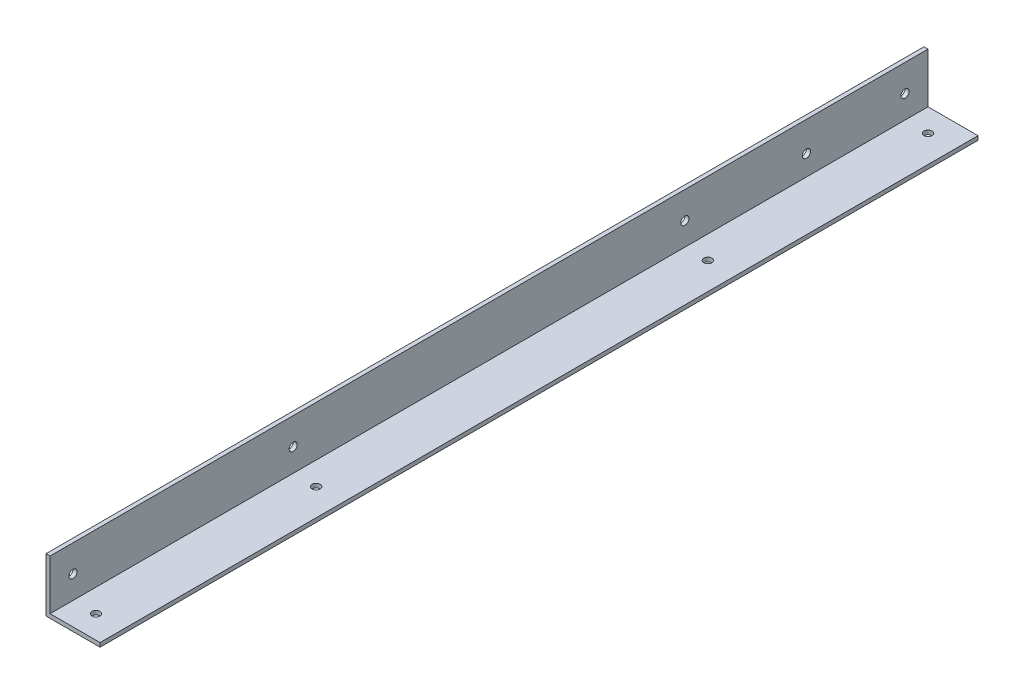
ISO-10303-21;
HEADER;
FILE_DESCRIPTION(('STEP AP214'),'2;1');
FILE_NAME('part.step','',(''),(''),'','','');
FILE_SCHEMA(('AUTOMOTIVE_DESIGN { 1 0 10303 214 1 1 1 1 }'));
ENDSEC;
DATA;
#1=APPLICATION_CONTEXT('core data for automotive mechanical design processes');
#2=APPLICATION_PROTOCOL_DEFINITION('international standard','automotive_design',2000,#1);
#3=PRODUCT_CONTEXT('',#1,'mechanical');
#4=PRODUCT('Part','Part','',(#3));
#5=PRODUCT_RELATED_PRODUCT_CATEGORY('part','',(#4));
#6=PRODUCT_DEFINITION_FORMATION('','',#4);
#7=PRODUCT_DEFINITION_CONTEXT('part definition',#1,'design');
#8=PRODUCT_DEFINITION('design','',#6,#7);
#9=PRODUCT_DEFINITION_SHAPE('','',#8);
#10=(LENGTH_UNIT() NAMED_UNIT(*) SI_UNIT(.MILLI.,.METRE.));
#11=(NAMED_UNIT(*) PLANE_ANGLE_UNIT() SI_UNIT($,.RADIAN.));
#12=(NAMED_UNIT(*) SI_UNIT($,.STERADIAN.) SOLID_ANGLE_UNIT());
#13=UNCERTAINTY_MEASURE_WITH_UNIT(LENGTH_MEASURE(1.E-05),#10,'distance_accuracy_value','');
#14=(GEOMETRIC_REPRESENTATION_CONTEXT(3) GLOBAL_UNCERTAINTY_ASSIGNED_CONTEXT((#13)) GLOBAL_UNIT_ASSIGNED_CONTEXT((#10,
#11,#12)) REPRESENTATION_CONTEXT('',''));
#15=CARTESIAN_POINT('',(0.,0.,0.));
#16=DIRECTION('',(0.,0.,1.));
#17=DIRECTION('',(1.,0.,0.));
#18=AXIS2_PLACEMENT_3D('',#15,#16,#17);
#19=CARTESIAN_POINT('',(-15.9316863798358,4.77336842105263,325.));
#20=DIRECTION('',(0.,-1.,0.));
#21=DIRECTION('',(1.,0.,0.));
#22=AXIS2_PLACEMENT_3D('',#19,#20,#21);
#23=PLANE('',#22);
#24=DIRECTION('',(-1.,0.,0.));
#25=VECTOR('',#24,1.);
#26=CARTESIAN_POINT('',(-15.9316863798358,4.77336842105263,0.));
#27=LINE('',#26,#25);
#28=CARTESIAN_POINT('',(-15.9316863798358,4.77336842105263,0.));
#29=VERTEX_POINT('',#28);
#30=CARTESIAN_POINT('',(-17.4316863798358,4.77336842105263,0.));
#31=VERTEX_POINT('',#30);
#32=EDGE_CURVE('E115',#29,#31,#27,.T.);
#33=ORIENTED_EDGE('',*,*,#32,.T.);
#34=DIRECTION('',(0.,0.,-1.));
#35=VECTOR('',#34,1.);
#36=CARTESIAN_POINT('',(-17.4316863798358,4.77336842105263,325.));
#37=LINE('',#36,#35);
#38=CARTESIAN_POINT('',(-17.4316863798358,4.77336842105263,325.));
#39=VERTEX_POINT('',#38);
#40=EDGE_CURVE('E11',#39,#31,#37,.T.);
#41=ORIENTED_EDGE('',*,*,#40,.F.);
#42=DIRECTION('',(-1.,0.,0.));
#43=VECTOR('',#42,1.);
#44=CARTESIAN_POINT('',(-15.9316863798358,4.77336842105263,325.));
#45=LINE('',#44,#43);
#46=CARTESIAN_POINT('',(-15.9316863798358,4.77336842105263,325.));
#47=VERTEX_POINT('',#46);
#48=EDGE_CURVE('E126',#47,#39,#45,.T.);
#49=ORIENTED_EDGE('',*,*,#48,.F.);
#50=DIRECTION('',(0.,0.,-1.));
#51=VECTOR('',#50,1.);
#52=CARTESIAN_POINT('',(-15.9316863798358,4.77336842105263,325.));
#53=LINE('',#52,#51);
#54=EDGE_CURVE('E111',#47,#29,#53,.T.);
#55=ORIENTED_EDGE('',*,*,#54,.T.);
#56=EDGE_LOOP('',(#33,#41,#49,#55));
#57=FACE_BOUND('',#56,.T.);
#58=ADVANCED_FACE('F31',(#57),#23,.F.);
#59=CARTESIAN_POINT('',(-17.4316863798358,4.77336842105263,325.));
#60=DIRECTION('',(1.,0.,0.));
#61=DIRECTION('',(0.,1.,0.));
#62=AXIS2_PLACEMENT_3D('',#59,#60,#61);
#63=PLANE('',#62);
#64=CARTESIAN_POINT('',(-17.4316863798358,-6.22663157894737,45.));
#65=DIRECTION('',(1.,0.,0.));
#66=DIRECTION('',(0.,1.,0.));
#67=AXIS2_PLACEMENT_3D('',#64,#65,#66);
#68=CIRCLE('',#67,1.5);
#69=CARTESIAN_POINT('',(-17.4316863798358,-4.72663157894736,45.));
#70=VERTEX_POINT('',#69);
#71=EDGE_CURVE('E298',#70,#70,#68,.T.);
#72=ORIENTED_EDGE('',*,*,#71,.T.);
#73=EDGE_LOOP('',(#72));
#74=FACE_BOUND('',#73,.T.);
#75=CARTESIAN_POINT('',(-17.4316863798358,-5.22663157894737,90.));
#76=DIRECTION('',(1.,0.,0.));
#77=DIRECTION('',(0.,1.,0.));
#78=AXIS2_PLACEMENT_3D('',#75,#76,#77);
#79=CIRCLE('',#78,1.5);
#80=CARTESIAN_POINT('',(-17.4316863798358,-3.72663157894737,90.));
#81=VERTEX_POINT('',#80);
#82=EDGE_CURVE('E302',#81,#81,#79,.T.);
#83=ORIENTED_EDGE('',*,*,#82,.T.);
#84=EDGE_LOOP('',(#83));
#85=FACE_BOUND('',#84,.T.);
#86=CARTESIAN_POINT('',(-17.4316863798358,-5.22663157894737,235.));
#87=DIRECTION('',(1.,0.,0.));
#88=DIRECTION('',(0.,1.,0.));
#89=AXIS2_PLACEMENT_3D('',#86,#87,#88);
#90=CIRCLE('',#89,1.50000000000003);
#91=CARTESIAN_POINT('',(-17.4316863798358,-3.72663157894734,235.));
#92=VERTEX_POINT('',#91);
#93=EDGE_CURVE('E311',#92,#92,#90,.T.);
#94=ORIENTED_EDGE('',*,*,#93,.T.);
#95=EDGE_LOOP('',(#94));
#96=FACE_BOUND('',#95,.T.);
#97=CARTESIAN_POINT('',(-17.4316863798358,-5.22663157894737,8.50000000000001));
#98=DIRECTION('',(1.,0.,0.));
#99=DIRECTION('',(0.,1.,0.));
#100=AXIS2_PLACEMENT_3D('',#97,#98,#99);
#101=CIRCLE('',#100,1.5);
#102=CARTESIAN_POINT('',(-17.4316863798358,-3.72663157894737,8.50000000000001));
#103=VERTEX_POINT('',#102);
#104=EDGE_CURVE('E317',#103,#103,#101,.T.);
#105=ORIENTED_EDGE('',*,*,#104,.T.);
#106=EDGE_LOOP('',(#105));
#107=FACE_BOUND('',#106,.T.);
#108=CARTESIAN_POINT('',(-17.4316863798358,-5.22663157894737,316.5));
#109=DIRECTION('',(1.,0.,0.));
#110=DIRECTION('',(0.,1.,0.));
#111=AXIS2_PLACEMENT_3D('',#108,#109,#110);
#112=CIRCLE('',#111,1.50000000000002);
#113=CARTESIAN_POINT('',(-17.4316863798358,-3.72663157894735,316.5));
#114=VERTEX_POINT('',#113);
#115=EDGE_CURVE('E323',#114,#114,#112,.T.);
#116=ORIENTED_EDGE('',*,*,#115,.T.);
#117=EDGE_LOOP('',(#116));
#118=FACE_BOUND('',#117,.T.);
#119=DIRECTION('',(0.,-1.,0.));
#120=VECTOR('',#119,1.);
#121=CARTESIAN_POINT('',(-17.4316863798358,4.77336842105263,0.));
#122=LINE('',#121,#120);
#123=CARTESIAN_POINT('',(-17.4316863798357,-15.2266315789474,0.));
#124=VERTEX_POINT('',#123);
#125=EDGE_CURVE('E118',#31,#124,#122,.T.);
#126=ORIENTED_EDGE('',*,*,#125,.T.);
#127=DIRECTION('',(0.,0.,-1.));
#128=VECTOR('',#127,1.);
#129=CARTESIAN_POINT('',(-17.4316863798357,-15.2266315789474,325.));
#130=LINE('',#129,#128);
#131=CARTESIAN_POINT('',(-17.4316863798357,-15.2266315789474,325.));
#132=VERTEX_POINT('',#131);
#133=EDGE_CURVE('E39',#132,#124,#130,.T.);
#134=ORIENTED_EDGE('',*,*,#133,.F.);
#135=DIRECTION('',(0.,-1.,0.));
#136=VECTOR('',#135,1.);
#137=CARTESIAN_POINT('',(-17.4316863798358,4.77336842105263,325.));
#138=LINE('',#137,#136);
#139=EDGE_CURVE('E84',#39,#132,#138,.T.);
#140=ORIENTED_EDGE('',*,*,#139,.F.);
#141=ORIENTED_EDGE('',*,*,#40,.T.);
#142=EDGE_LOOP('',(#126,#134,#140,#141));
#143=FACE_BOUND('',#142,.T.);
#144=ADVANCED_FACE('F154',(#74,#85,#96,#107,#118,#143),#63,.F.);
#145=CARTESIAN_POINT('',(-17.4316863798357,-15.2266315789474,325.));
#146=DIRECTION('',(0.,1.,0.));
#147=DIRECTION('',(0.,0.,1.));
#148=AXIS2_PLACEMENT_3D('',#145,#146,#147);
#149=PLANE('',#148);
#150=CARTESIAN_POINT('',(-7.43168637983575,-15.2266315789474,90.));
#151=DIRECTION('',(0.,1.,0.));
#152=DIRECTION('',(0.,0.,1.));
#153=AXIS2_PLACEMENT_3D('',#150,#151,#152);
#154=CIRCLE('',#153,1.5);
#155=CARTESIAN_POINT('',(-7.43168637983575,-15.2266315789474,91.5));
#156=VERTEX_POINT('',#155);
#157=EDGE_CURVE('E329',#156,#156,#154,.T.);
#158=ORIENTED_EDGE('',*,*,#157,.T.);
#159=EDGE_LOOP('',(#158));
#160=FACE_BOUND('',#159,.T.);
#161=CARTESIAN_POINT('',(-7.43168637983575,-15.2266315789474,235.));
#162=DIRECTION('',(0.,1.,0.));
#163=DIRECTION('',(0.,0.,1.));
#164=AXIS2_PLACEMENT_3D('',#161,#162,#163);
#165=CIRCLE('',#164,1.5);
#166=CARTESIAN_POINT('',(-7.43168637983575,-15.2266315789474,236.5));
#167=VERTEX_POINT('',#166);
#168=EDGE_CURVE('E335',#167,#167,#165,.T.);
#169=ORIENTED_EDGE('',*,*,#168,.T.);
#170=EDGE_LOOP('',(#169));
#171=FACE_BOUND('',#170,.T.);
#172=CARTESIAN_POINT('',(-7.43168637983575,-15.2266315789474,316.5));
#173=DIRECTION('',(0.,1.,0.));
#174=DIRECTION('',(0.,0.,1.));
#175=AXIS2_PLACEMENT_3D('',#172,#173,#174);
#176=CIRCLE('',#175,1.5);
#177=CARTESIAN_POINT('',(-7.43168637983575,-15.2266315789474,318.));
#178=VERTEX_POINT('',#177);
#179=EDGE_CURVE('E341',#178,#178,#176,.T.);
#180=ORIENTED_EDGE('',*,*,#179,.T.);
#181=EDGE_LOOP('',(#180));
#182=FACE_BOUND('',#181,.T.);
#183=CARTESIAN_POINT('',(-7.43168637983575,-15.2266315789474,8.50000000000001));
#184=DIRECTION('',(0.,1.,0.));
#185=DIRECTION('',(0.,0.,1.));
#186=AXIS2_PLACEMENT_3D('',#183,#184,#185);
#187=CIRCLE('',#186,1.5);
#188=CARTESIAN_POINT('',(-7.43168637983575,-15.2266315789474,10.));
#189=VERTEX_POINT('',#188);
#190=EDGE_CURVE('E119',#189,#189,#187,.T.);
#191=ORIENTED_EDGE('',*,*,#190,.T.);
#192=EDGE_LOOP('',(#191));
#193=FACE_BOUND('',#192,.T.);
#194=DIRECTION('',(1.,0.,0.));
#195=VECTOR('',#194,1.);
#196=CARTESIAN_POINT('',(-17.4316863798357,-15.2266315789474,0.));
#197=LINE('',#196,#195);
#198=CARTESIAN_POINT('',(2.56831362016425,-15.2266315789474,0.));
#199=VERTEX_POINT('',#198);
#200=EDGE_CURVE('E121',#124,#199,#197,.T.);
#201=ORIENTED_EDGE('',*,*,#200,.T.);
#202=DIRECTION('',(0.,0.,-1.));
#203=VECTOR('',#202,1.);
#204=CARTESIAN_POINT('',(2.56831362016425,-15.2266315789474,325.));
#205=LINE('',#204,#203);
#206=CARTESIAN_POINT('',(2.56831362016425,-15.2266315789474,325.));
#207=VERTEX_POINT('',#206);
#208=EDGE_CURVE('E106',#207,#199,#205,.T.);
#209=ORIENTED_EDGE('',*,*,#208,.F.);
#210=DIRECTION('',(1.,0.,0.));
#211=VECTOR('',#210,1.);
#212=CARTESIAN_POINT('',(-17.4316863798357,-15.2266315789474,325.));
#213=LINE('',#212,#211);
#214=EDGE_CURVE('E97',#132,#207,#213,.T.);
#215=ORIENTED_EDGE('',*,*,#214,.F.);
#216=ORIENTED_EDGE('',*,*,#133,.T.);
#217=EDGE_LOOP('',(#201,#209,#215,#216));
#218=FACE_BOUND('',#217,.T.);
#219=ADVANCED_FACE('F132',(#160,#171,#182,#193,#218),#149,.F.);
#220=CARTESIAN_POINT('',(2.56831362016425,-15.2266315789474,325.));
#221=DIRECTION('',(-1.,0.,0.));
#222=DIRECTION('',(0.,0.,1.));
#223=AXIS2_PLACEMENT_3D('',#220,#221,#222);
#224=PLANE('',#223);
#225=DIRECTION('',(0.,1.,0.));
#226=VECTOR('',#225,1.);
#227=CARTESIAN_POINT('',(2.56831362016425,-15.2266315789474,0.));
#228=LINE('',#227,#226);
#229=CARTESIAN_POINT('',(2.56831362016425,-13.7266315789474,0.));
#230=VERTEX_POINT('',#229);
#231=EDGE_CURVE('E105',#199,#230,#228,.T.);
#232=ORIENTED_EDGE('',*,*,#231,.T.);
#233=DIRECTION('',(0.,0.,-1.));
#234=VECTOR('',#233,1.);
#235=CARTESIAN_POINT('',(2.56831362016425,-13.7266315789474,325.));
#236=LINE('',#235,#234);
#237=CARTESIAN_POINT('',(2.56831362016425,-13.7266315789474,325.));
#238=VERTEX_POINT('',#237);
#239=EDGE_CURVE('E102',#238,#230,#236,.T.);
#240=ORIENTED_EDGE('',*,*,#239,.F.);
#241=DIRECTION('',(0.,1.,0.));
#242=VECTOR('',#241,1.);
#243=CARTESIAN_POINT('',(2.56831362016425,-15.2266315789474,325.));
#244=LINE('',#243,#242);
#245=EDGE_CURVE('E91',#207,#238,#244,.T.);
#246=ORIENTED_EDGE('',*,*,#245,.F.);
#247=ORIENTED_EDGE('',*,*,#208,.T.);
#248=EDGE_LOOP('',(#232,#240,#246,#247));
#249=FACE_BOUND('',#248,.T.);
#250=ADVANCED_FACE('F103',(#249),#224,.F.);
#251=CARTESIAN_POINT('',(2.56831362016425,-13.7266315789474,325.));
#252=DIRECTION('',(0.,-1.,0.));
#253=DIRECTION('',(1.,0.,0.));
#254=AXIS2_PLACEMENT_3D('',#251,#252,#253);
#255=PLANE('',#254);
#256=CARTESIAN_POINT('',(-7.43168637983575,-13.7266315789474,90.));
#257=DIRECTION('',(0.,1.,0.));
#258=DIRECTION('',(-1.,0.,0.));
#259=AXIS2_PLACEMENT_3D('',#256,#257,#258);
#260=CIRCLE('',#259,1.5);
#261=CARTESIAN_POINT('',(-8.93168637983575,-13.7266315789474,90.));
#262=VERTEX_POINT('',#261);
#263=EDGE_CURVE('E326',#262,#262,#260,.T.);
#264=ORIENTED_EDGE('',*,*,#263,.F.);
#265=EDGE_LOOP('',(#264));
#266=FACE_BOUND('',#265,.T.);
#267=CARTESIAN_POINT('',(-7.43168637983575,-13.7266315789474,235.));
#268=DIRECTION('',(0.,1.,0.));
#269=DIRECTION('',(-1.,0.,0.));
#270=AXIS2_PLACEMENT_3D('',#267,#268,#269);
#271=CIRCLE('',#270,1.5);
#272=CARTESIAN_POINT('',(-8.93168637983575,-13.7266315789474,235.));
#273=VERTEX_POINT('',#272);
#274=EDGE_CURVE('E332',#273,#273,#271,.T.);
#275=ORIENTED_EDGE('',*,*,#274,.F.);
#276=EDGE_LOOP('',(#275));
#277=FACE_BOUND('',#276,.T.);
#278=CARTESIAN_POINT('',(-7.43168637983575,-13.7266315789474,316.5));
#279=DIRECTION('',(0.,1.,0.));
#280=DIRECTION('',(-1.,0.,0.));
#281=AXIS2_PLACEMENT_3D('',#278,#279,#280);
#282=CIRCLE('',#281,1.5);
#283=CARTESIAN_POINT('',(-8.93168637983575,-13.7266315789474,316.5));
#284=VERTEX_POINT('',#283);
#285=EDGE_CURVE('E338',#284,#284,#282,.T.);
#286=ORIENTED_EDGE('',*,*,#285,.F.);
#287=EDGE_LOOP('',(#286));
#288=FACE_BOUND('',#287,.T.);
#289=CARTESIAN_POINT('',(-7.43168637983575,-13.7266315789474,8.50000000000001));
#290=DIRECTION('',(0.,1.,0.));
#291=DIRECTION('',(-1.,0.,0.));
#292=AXIS2_PLACEMENT_3D('',#289,#290,#291);
#293=CIRCLE('',#292,1.5);
#294=CARTESIAN_POINT('',(-8.93168637983575,-13.7266315789474,8.50000000000001));
#295=VERTEX_POINT('',#294);
#296=EDGE_CURVE('E344',#295,#295,#293,.T.);
#297=ORIENTED_EDGE('',*,*,#296,.F.);
#298=EDGE_LOOP('',(#297));
#299=FACE_BOUND('',#298,.T.);
#300=DIRECTION('',(-1.,0.,0.));
#301=VECTOR('',#300,1.);
#302=CARTESIAN_POINT('',(2.56831362016425,-13.7266315789474,0.));
#303=LINE('',#302,#301);
#304=CARTESIAN_POINT('',(-15.9316863798358,-13.7266315789474,0.));
#305=VERTEX_POINT('',#304);
#306=EDGE_CURVE('E70',#230,#305,#303,.T.);
#307=ORIENTED_EDGE('',*,*,#306,.T.);
#308=DIRECTION('',(0.,0.,-1.));
#309=VECTOR('',#308,1.);
#310=CARTESIAN_POINT('',(-15.9316863798358,-13.7266315789474,325.));
#311=LINE('',#310,#309);
#312=CARTESIAN_POINT('',(-15.9316863798358,-13.7266315789474,325.));
#313=VERTEX_POINT('',#312);
#314=EDGE_CURVE('E107',#313,#305,#311,.T.);
#315=ORIENTED_EDGE('',*,*,#314,.F.);
#316=DIRECTION('',(-1.,0.,0.));
#317=VECTOR('',#316,1.);
#318=CARTESIAN_POINT('',(2.56831362016425,-13.7266315789474,325.));
#319=LINE('',#318,#317);
#320=EDGE_CURVE('E95',#238,#313,#319,.T.);
#321=ORIENTED_EDGE('',*,*,#320,.F.);
#322=ORIENTED_EDGE('',*,*,#239,.T.);
#323=EDGE_LOOP('',(#307,#315,#321,#322));
#324=FACE_BOUND('',#323,.T.);
#325=ADVANCED_FACE('F109',(#266,#277,#288,#299,#324),#255,.F.);
#326=CARTESIAN_POINT('',(-15.9316863798358,-13.7266315789474,325.));
#327=DIRECTION('',(-1.,0.,0.));
#328=DIRECTION('',(0.,0.,1.));
#329=AXIS2_PLACEMENT_3D('',#326,#327,#328);
#330=PLANE('',#329);
#331=CARTESIAN_POINT('',(-15.9316863798358,-6.22663157894737,45.));
#332=DIRECTION('',(1.,0.,0.));
#333=DIRECTION('',(0.,0.,-1.));
#334=AXIS2_PLACEMENT_3D('',#331,#332,#333);
#335=CIRCLE('',#334,1.5);
#336=CARTESIAN_POINT('',(-15.9316863798358,-6.22663157894737,43.5));
#337=VERTEX_POINT('',#336);
#338=EDGE_CURVE('E296',#337,#337,#335,.T.);
#339=ORIENTED_EDGE('',*,*,#338,.F.);
#340=EDGE_LOOP('',(#339));
#341=FACE_BOUND('',#340,.T.);
#342=CARTESIAN_POINT('',(-15.9316863798358,-5.22663157894737,90.));
#343=DIRECTION('',(1.,0.,0.));
#344=DIRECTION('',(0.,0.,-1.));
#345=AXIS2_PLACEMENT_3D('',#342,#343,#344);
#346=CIRCLE('',#345,1.5);
#347=CARTESIAN_POINT('',(-15.9316863798358,-5.22663157894737,88.5));
#348=VERTEX_POINT('',#347);
#349=EDGE_CURVE('E299',#348,#348,#346,.T.);
#350=ORIENTED_EDGE('',*,*,#349,.F.);
#351=EDGE_LOOP('',(#350));
#352=FACE_BOUND('',#351,.T.);
#353=CARTESIAN_POINT('',(-15.9316863798358,-5.22663157894737,235.));
#354=DIRECTION('',(1.,0.,0.));
#355=DIRECTION('',(0.,0.,-1.));
#356=AXIS2_PLACEMENT_3D('',#353,#354,#355);
#357=CIRCLE('',#356,1.50000000000003);
#358=CARTESIAN_POINT('',(-15.9316863798358,-5.22663157894737,233.5));
#359=VERTEX_POINT('',#358);
#360=EDGE_CURVE('E308',#359,#359,#357,.T.);
#361=ORIENTED_EDGE('',*,*,#360,.F.);
#362=EDGE_LOOP('',(#361));
#363=FACE_BOUND('',#362,.T.);
#364=CARTESIAN_POINT('',(-15.9316863798358,-5.22663157894737,8.50000000000001));
#365=DIRECTION('',(1.,0.,0.));
#366=DIRECTION('',(0.,0.,-1.));
#367=AXIS2_PLACEMENT_3D('',#364,#365,#366);
#368=CIRCLE('',#367,1.5);
#369=CARTESIAN_POINT('',(-15.9316863798358,-5.22663157894737,7.00000000000001));
#370=VERTEX_POINT('',#369);
#371=EDGE_CURVE('E314',#370,#370,#368,.T.);
#372=ORIENTED_EDGE('',*,*,#371,.F.);
#373=EDGE_LOOP('',(#372));
#374=FACE_BOUND('',#373,.T.);
#375=CARTESIAN_POINT('',(-15.9316863798358,-5.22663157894737,316.5));
#376=DIRECTION('',(1.,0.,0.));
#377=DIRECTION('',(0.,0.,-1.));
#378=AXIS2_PLACEMENT_3D('',#375,#376,#377);
#379=CIRCLE('',#378,1.50000000000002);
#380=CARTESIAN_POINT('',(-15.9316863798358,-5.22663157894737,315.));
#381=VERTEX_POINT('',#380);
#382=EDGE_CURVE('E320',#381,#381,#379,.T.);
#383=ORIENTED_EDGE('',*,*,#382,.F.);
#384=EDGE_LOOP('',(#383));
#385=FACE_BOUND('',#384,.T.);
#386=DIRECTION('',(0.,1.,0.));
#387=VECTOR('',#386,1.);
#388=CARTESIAN_POINT('',(-15.9316863798358,-13.7266315789474,0.));
#389=LINE('',#388,#387);
#390=EDGE_CURVE('E76',#305,#29,#389,.T.);
#391=ORIENTED_EDGE('',*,*,#390,.T.);
#392=ORIENTED_EDGE('',*,*,#54,.F.);
#393=DIRECTION('',(0.,1.,0.));
#394=VECTOR('',#393,1.);
#395=CARTESIAN_POINT('',(-15.9316863798358,-13.7266315789474,325.));
#396=LINE('',#395,#394);
#397=EDGE_CURVE('E47',#313,#47,#396,.T.);
#398=ORIENTED_EDGE('',*,*,#397,.F.);
#399=ORIENTED_EDGE('',*,*,#314,.T.);
#400=EDGE_LOOP('',(#391,#392,#398,#399));
#401=FACE_BOUND('',#400,.T.);
#402=ADVANCED_FACE('F139',(#341,#352,#363,#374,#385,#401),#330,.F.);
#403=CARTESIAN_POINT('',(-17.4316863798358,4.77336842105263,325.));
#404=DIRECTION('',(0.,0.,1.));
#405=DIRECTION('',(1.,0.,0.));
#406=AXIS2_PLACEMENT_3D('',#403,#404,#405);
#407=PLANE('',#406);
#408=ORIENTED_EDGE('',*,*,#48,.T.);
#409=ORIENTED_EDGE('',*,*,#139,.T.);
#410=ORIENTED_EDGE('',*,*,#214,.T.);
#411=ORIENTED_EDGE('',*,*,#245,.T.);
#412=ORIENTED_EDGE('',*,*,#320,.T.);
#413=ORIENTED_EDGE('',*,*,#397,.T.);
#414=EDGE_LOOP('',(#408,#409,#410,#411,#412,#413));
#415=FACE_BOUND('',#414,.T.);
#416=ADVANCED_FACE('F93',(#415),#407,.T.);
#417=CARTESIAN_POINT('',(-17.4316863798358,4.77336842105263,0.));
#418=DIRECTION('',(0.,0.,1.));
#419=DIRECTION('',(1.,0.,0.));
#420=AXIS2_PLACEMENT_3D('',#417,#418,#419);
#421=PLANE('',#420);
#422=ORIENTED_EDGE('',*,*,#32,.F.);
#423=ORIENTED_EDGE('',*,*,#390,.F.);
#424=ORIENTED_EDGE('',*,*,#306,.F.);
#425=ORIENTED_EDGE('',*,*,#231,.F.);
#426=ORIENTED_EDGE('',*,*,#200,.F.);
#427=ORIENTED_EDGE('',*,*,#125,.F.);
#428=EDGE_LOOP('',(#422,#423,#424,#425,#426,#427));
#429=FACE_BOUND('',#428,.T.);
#430=ADVANCED_FACE('F135',(#429),#421,.F.);
#431=CARTESIAN_POINT('',(-7.43168637983563,-313.726631578947,8.50000000000001));
#432=DIRECTION('',(0.,1.,0.));
#433=DIRECTION('',(-1.,0.,0.));
#434=AXIS2_PLACEMENT_3D('',#431,#432,#433);
#435=CYLINDRICAL_SURFACE('',#434,1.5);
#436=ORIENTED_EDGE('',*,*,#296,.T.);
#437=EDGE_LOOP('',(#436));
#438=FACE_BOUND('',#437,.T.);
#439=ORIENTED_EDGE('',*,*,#190,.F.);
#440=EDGE_LOOP('',(#439));
#441=FACE_BOUND('',#440,.T.);
#442=ADVANCED_FACE('F186',(#438,#441),#435,.F.);
#443=CARTESIAN_POINT('',(-7.43168637983563,-313.726631578947,316.5));
#444=DIRECTION('',(0.,1.,0.));
#445=DIRECTION('',(-1.,0.,0.));
#446=AXIS2_PLACEMENT_3D('',#443,#444,#445);
#447=CYLINDRICAL_SURFACE('',#446,1.5);
#448=ORIENTED_EDGE('',*,*,#285,.T.);
#449=EDGE_LOOP('',(#448));
#450=FACE_BOUND('',#449,.T.);
#451=ORIENTED_EDGE('',*,*,#179,.F.);
#452=EDGE_LOOP('',(#451));
#453=FACE_BOUND('',#452,.T.);
#454=ADVANCED_FACE('F191',(#450,#453),#447,.F.);
#455=CARTESIAN_POINT('',(-7.43168637983563,-313.726631578947,235.));
#456=DIRECTION('',(0.,1.,0.));
#457=DIRECTION('',(-1.,0.,0.));
#458=AXIS2_PLACEMENT_3D('',#455,#456,#457);
#459=CYLINDRICAL_SURFACE('',#458,1.5);
#460=ORIENTED_EDGE('',*,*,#274,.T.);
#461=EDGE_LOOP('',(#460));
#462=FACE_BOUND('',#461,.T.);
#463=ORIENTED_EDGE('',*,*,#168,.F.);
#464=EDGE_LOOP('',(#463));
#465=FACE_BOUND('',#464,.T.);
#466=ADVANCED_FACE('F203',(#462,#465),#459,.F.);
#467=CARTESIAN_POINT('',(-7.43168637983563,-313.726631578947,90.));
#468=DIRECTION('',(0.,1.,0.));
#469=DIRECTION('',(-1.,0.,0.));
#470=AXIS2_PLACEMENT_3D('',#467,#468,#469);
#471=CYLINDRICAL_SURFACE('',#470,1.5);
#472=ORIENTED_EDGE('',*,*,#263,.T.);
#473=EDGE_LOOP('',(#472));
#474=FACE_BOUND('',#473,.T.);
#475=ORIENTED_EDGE('',*,*,#157,.F.);
#476=EDGE_LOOP('',(#475));
#477=FACE_BOUND('',#476,.T.);
#478=ADVANCED_FACE('F213',(#474,#477),#471,.F.);
#479=CARTESIAN_POINT('',(-315.931686379836,-5.22663157894737,316.5));
#480=DIRECTION('',(1.,0.,0.));
#481=DIRECTION('',(0.,0.,-1.));
#482=AXIS2_PLACEMENT_3D('',#479,#480,#481);
#483=CYLINDRICAL_SURFACE('',#482,1.50000000000002);
#484=ORIENTED_EDGE('',*,*,#382,.T.);
#485=EDGE_LOOP('',(#484));
#486=FACE_BOUND('',#485,.T.);
#487=ORIENTED_EDGE('',*,*,#115,.F.);
#488=EDGE_LOOP('',(#487));
#489=FACE_BOUND('',#488,.T.);
#490=ADVANCED_FACE('F222',(#486,#489),#483,.F.);
#491=CARTESIAN_POINT('',(-315.931686379836,-5.22663157894737,8.50000000000001));
#492=DIRECTION('',(1.,0.,0.));
#493=DIRECTION('',(0.,0.,-1.));
#494=AXIS2_PLACEMENT_3D('',#491,#492,#493);
#495=CYLINDRICAL_SURFACE('',#494,1.5);
#496=ORIENTED_EDGE('',*,*,#371,.T.);
#497=EDGE_LOOP('',(#496));
#498=FACE_BOUND('',#497,.T.);
#499=ORIENTED_EDGE('',*,*,#104,.F.);
#500=EDGE_LOOP('',(#499));
#501=FACE_BOUND('',#500,.T.);
#502=ADVANCED_FACE('F242',(#498,#501),#495,.F.);
#503=CARTESIAN_POINT('',(-315.931686379836,-5.22663157894737,235.));
#504=DIRECTION('',(1.,0.,0.));
#505=DIRECTION('',(0.,0.,-1.));
#506=AXIS2_PLACEMENT_3D('',#503,#504,#505);
#507=CYLINDRICAL_SURFACE('',#506,1.50000000000003);
#508=ORIENTED_EDGE('',*,*,#360,.T.);
#509=EDGE_LOOP('',(#508));
#510=FACE_BOUND('',#509,.T.);
#511=ORIENTED_EDGE('',*,*,#93,.F.);
#512=EDGE_LOOP('',(#511));
#513=FACE_BOUND('',#512,.T.);
#514=ADVANCED_FACE('F252',(#510,#513),#507,.F.);
#515=CARTESIAN_POINT('',(-315.931686379836,-5.22663157894737,90.));
#516=DIRECTION('',(1.,0.,0.));
#517=DIRECTION('',(0.,0.,-1.));
#518=AXIS2_PLACEMENT_3D('',#515,#516,#517);
#519=CYLINDRICAL_SURFACE('',#518,1.5);
#520=ORIENTED_EDGE('',*,*,#349,.T.);
#521=EDGE_LOOP('',(#520));
#522=FACE_BOUND('',#521,.T.);
#523=ORIENTED_EDGE('',*,*,#82,.F.);
#524=EDGE_LOOP('',(#523));
#525=FACE_BOUND('',#524,.T.);
#526=ADVANCED_FACE('F262',(#522,#525),#519,.F.);
#527=CARTESIAN_POINT('',(-315.931686379836,-6.22663157894737,45.));
#528=DIRECTION('',(1.,0.,0.));
#529=DIRECTION('',(0.,0.,-1.));
#530=AXIS2_PLACEMENT_3D('',#527,#528,#529);
#531=CYLINDRICAL_SURFACE('',#530,1.5);
#532=ORIENTED_EDGE('',*,*,#338,.T.);
#533=EDGE_LOOP('',(#532));
#534=FACE_BOUND('',#533,.T.);
#535=ORIENTED_EDGE('',*,*,#71,.F.);
#536=EDGE_LOOP('',(#535));
#537=FACE_BOUND('',#536,.T.);
#538=ADVANCED_FACE('F272',(#534,#537),#531,.F.);
#539=CLOSED_SHELL('',(#58,#144,#219,#250,#325,#402,#416,#430,#442,#454,#466,#478,#490,#502,#514,
#526,#538));
#540=MANIFOLD_SOLID_BREP('B2',#539);
#541=ADVANCED_BREP_SHAPE_REPRESENTATION('',(#18,#540),#14);
#542=SHAPE_DEFINITION_REPRESENTATION(#9,#541);
ENDSEC;
END-ISO-10303-21;
